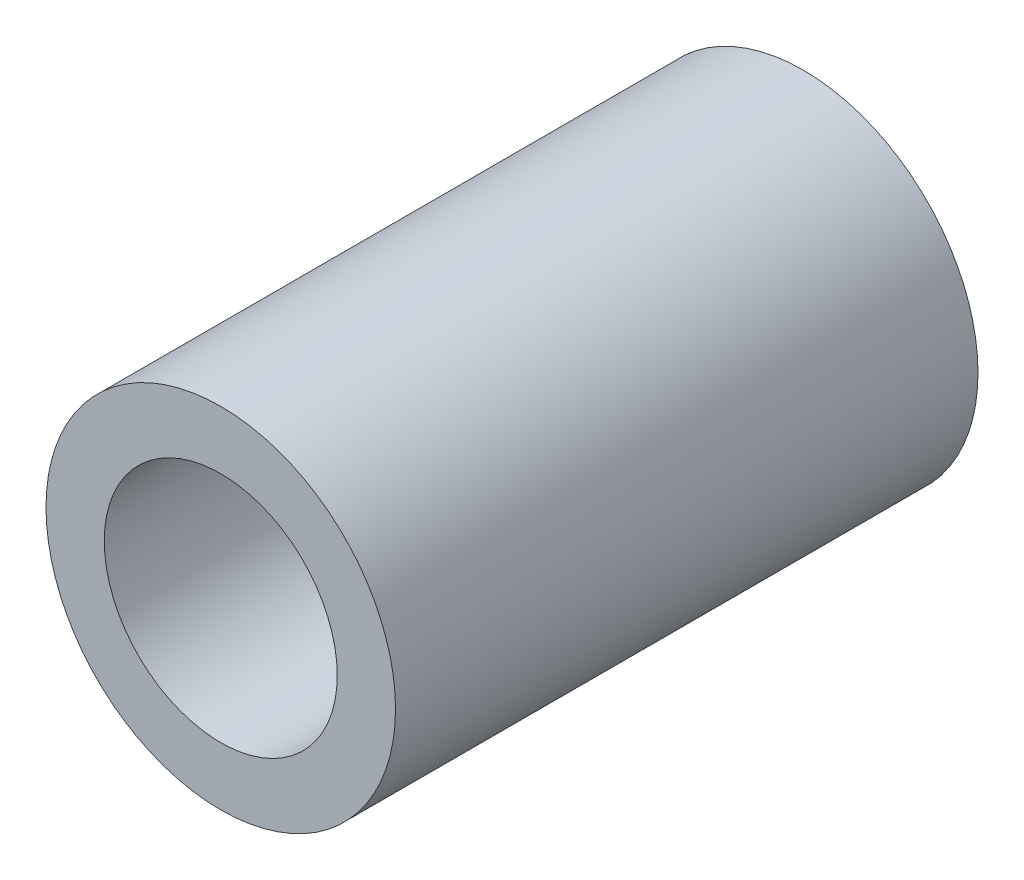
ISO-10303-21;
HEADER;
FILE_DESCRIPTION(('STEP AP214'),'2;1');
FILE_NAME('part.step','',(''),(''),'','','');
FILE_SCHEMA(('AUTOMOTIVE_DESIGN { 1 0 10303 214 1 1 1 1 }'));
ENDSEC;
DATA;
#1=APPLICATION_CONTEXT('core data for automotive mechanical design processes');
#2=APPLICATION_PROTOCOL_DEFINITION('international standard','automotive_design',2000,#1);
#3=PRODUCT_CONTEXT('',#1,'mechanical');
#4=PRODUCT('Part','Part','',(#3));
#5=PRODUCT_RELATED_PRODUCT_CATEGORY('part','',(#4));
#6=PRODUCT_DEFINITION_FORMATION('','',#4);
#7=PRODUCT_DEFINITION_CONTEXT('part definition',#1,'design');
#8=PRODUCT_DEFINITION('design','',#6,#7);
#9=PRODUCT_DEFINITION_SHAPE('','',#8);
#10=(LENGTH_UNIT() NAMED_UNIT(*) SI_UNIT(.MILLI.,.METRE.));
#11=(NAMED_UNIT(*) PLANE_ANGLE_UNIT() SI_UNIT($,.RADIAN.));
#12=(NAMED_UNIT(*) SI_UNIT($,.STERADIAN.) SOLID_ANGLE_UNIT());
#13=UNCERTAINTY_MEASURE_WITH_UNIT(LENGTH_MEASURE(1.E-05),#10,'distance_accuracy_value','');
#14=(GEOMETRIC_REPRESENTATION_CONTEXT(3) GLOBAL_UNCERTAINTY_ASSIGNED_CONTEXT((#13)) GLOBAL_UNIT_ASSIGNED_CONTEXT((#10,
#11,#12)) REPRESENTATION_CONTEXT('',''));
#15=CARTESIAN_POINT('',(0.,0.,0.));
#16=DIRECTION('',(0.,0.,1.));
#17=DIRECTION('',(1.,0.,0.));
#18=AXIS2_PLACEMENT_3D('',#15,#16,#17);
#19=CARTESIAN_POINT('',(0.,0.,5.));
#20=DIRECTION('',(0.,0.,1.));
#21=DIRECTION('',(1.,0.,0.));
#22=AXIS2_PLACEMENT_3D('',#19,#20,#21);
#23=PLANE('',#22);
#24=CARTESIAN_POINT('',(0.,0.,5.));
#25=DIRECTION('',(0.,0.,1.));
#26=DIRECTION('',(1.,0.,0.));
#27=AXIS2_PLACEMENT_3D('',#24,#25,#26);
#28=CIRCLE('',#27,3.);
#29=CARTESIAN_POINT('',(3.,0.,5.));
#30=VERTEX_POINT('',#29);
#31=EDGE_CURVE('E10',#30,#30,#28,.T.);
#32=ORIENTED_EDGE('',*,*,#31,.T.);
#33=EDGE_LOOP('',(#32));
#34=FACE_BOUND('',#33,.T.);
#35=CARTESIAN_POINT('',(0.,0.,5.));
#36=DIRECTION('',(0.,0.,1.));
#37=DIRECTION('',(1.,0.,0.));
#38=AXIS2_PLACEMENT_3D('',#35,#36,#37);
#39=CIRCLE('',#38,2.);
#40=CARTESIAN_POINT('',(2.,0.,5.));
#41=VERTEX_POINT('',#40);
#42=EDGE_CURVE('E42',#41,#41,#39,.T.);
#43=ORIENTED_EDGE('',*,*,#42,.F.);
#44=EDGE_LOOP('',(#43));
#45=FACE_BOUND('',#44,.T.);
#46=ADVANCED_FACE('F31',(#34,#45),#23,.T.);
#47=CARTESIAN_POINT('',(0.,0.,-5.));
#48=DIRECTION('',(0.,0.,1.));
#49=DIRECTION('',(1.,0.,0.));
#50=AXIS2_PLACEMENT_3D('',#47,#48,#49);
#51=PLANE('',#50);
#52=CARTESIAN_POINT('',(0.,0.,-5.));
#53=DIRECTION('',(0.,0.,1.));
#54=DIRECTION('',(1.,0.,0.));
#55=AXIS2_PLACEMENT_3D('',#52,#53,#54);
#56=CIRCLE('',#55,3.);
#57=CARTESIAN_POINT('',(3.,0.,-5.));
#58=VERTEX_POINT('',#57);
#59=EDGE_CURVE('E35',#58,#58,#56,.T.);
#60=ORIENTED_EDGE('',*,*,#59,.F.);
#61=EDGE_LOOP('',(#60));
#62=FACE_BOUND('',#61,.T.);
#63=CARTESIAN_POINT('',(0.,0.,-5.));
#64=DIRECTION('',(0.,0.,1.));
#65=DIRECTION('',(1.,0.,0.));
#66=AXIS2_PLACEMENT_3D('',#63,#64,#65);
#67=CIRCLE('',#66,2.);
#68=CARTESIAN_POINT('',(2.,0.,-5.));
#69=VERTEX_POINT('',#68);
#70=EDGE_CURVE('E44',#69,#69,#67,.T.);
#71=ORIENTED_EDGE('',*,*,#70,.T.);
#72=EDGE_LOOP('',(#71));
#73=FACE_BOUND('',#72,.T.);
#74=ADVANCED_FACE('F54',(#62,#73),#51,.F.);
#75=CARTESIAN_POINT('',(0.,0.,5.));
#76=DIRECTION('',(0.,0.,-1.));
#77=DIRECTION('',(-1.,0.,0.));
#78=AXIS2_PLACEMENT_3D('',#75,#76,#77);
#79=CYLINDRICAL_SURFACE('',#78,3.);
#80=ORIENTED_EDGE('',*,*,#31,.F.);
#81=EDGE_LOOP('',(#80));
#82=FACE_BOUND('',#81,.T.);
#83=ORIENTED_EDGE('',*,*,#59,.T.);
#84=EDGE_LOOP('',(#83));
#85=FACE_BOUND('',#84,.T.);
#86=ADVANCED_FACE('F33',(#82,#85),#79,.T.);
#87=CARTESIAN_POINT('',(0.,0.,5.));
#88=DIRECTION('',(0.,0.,-1.));
#89=DIRECTION('',(-1.,0.,0.));
#90=AXIS2_PLACEMENT_3D('',#87,#88,#89);
#91=CYLINDRICAL_SURFACE('',#90,2.);
#92=ORIENTED_EDGE('',*,*,#42,.T.);
#93=EDGE_LOOP('',(#92));
#94=FACE_BOUND('',#93,.T.);
#95=ORIENTED_EDGE('',*,*,#70,.F.);
#96=EDGE_LOOP('',(#95));
#97=FACE_BOUND('',#96,.T.);
#98=ADVANCED_FACE('F50',(#94,#97),#91,.F.);
#99=CLOSED_SHELL('',(#46,#74,#86,#98));
#100=MANIFOLD_SOLID_BREP('B2',#99);
#101=ADVANCED_BREP_SHAPE_REPRESENTATION('',(#18,#100),#14);
#102=SHAPE_DEFINITION_REPRESENTATION(#9,#101);
ENDSEC;
END-ISO-10303-21;
